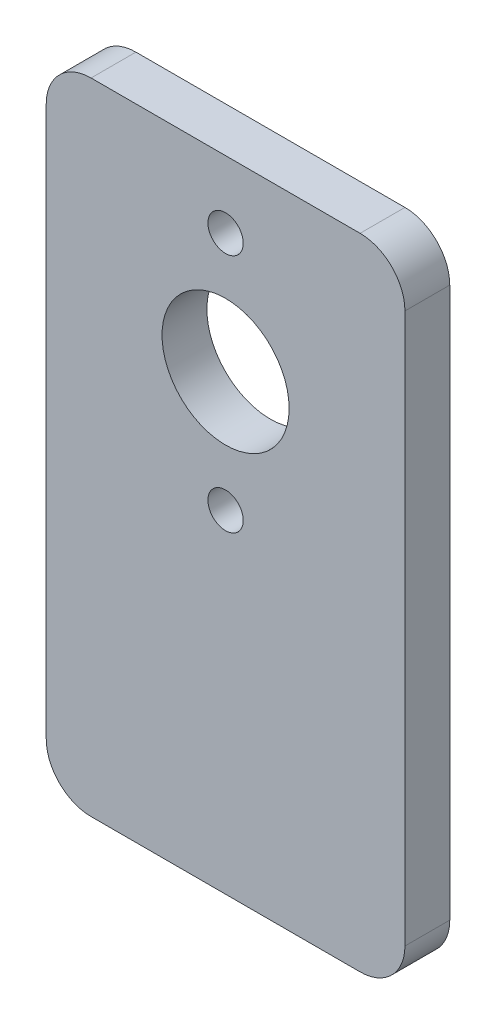
ISO-10303-21;
HEADER;
FILE_DESCRIPTION(('STEP AP214'),'2;1');
FILE_NAME('part.step','',(''),(''),'','','');
FILE_SCHEMA(('AUTOMOTIVE_DESIGN { 1 0 10303 214 1 1 1 1 }'));
ENDSEC;
DATA;
#1=APPLICATION_CONTEXT('core data for automotive mechanical design processes');
#2=APPLICATION_PROTOCOL_DEFINITION('international standard','automotive_design',2000,#1);
#3=PRODUCT_CONTEXT('',#1,'mechanical');
#4=PRODUCT('Part','Part','',(#3));
#5=PRODUCT_RELATED_PRODUCT_CATEGORY('part','',(#4));
#6=PRODUCT_DEFINITION_FORMATION('','',#4);
#7=PRODUCT_DEFINITION_CONTEXT('part definition',#1,'design');
#8=PRODUCT_DEFINITION('design','',#6,#7);
#9=PRODUCT_DEFINITION_SHAPE('','',#8);
#10=(LENGTH_UNIT() NAMED_UNIT(*) SI_UNIT(.MILLI.,.METRE.));
#11=(NAMED_UNIT(*) PLANE_ANGLE_UNIT() SI_UNIT($,.RADIAN.));
#12=(NAMED_UNIT(*) SI_UNIT($,.STERADIAN.) SOLID_ANGLE_UNIT());
#13=UNCERTAINTY_MEASURE_WITH_UNIT(LENGTH_MEASURE(1.E-05),#10,'distance_accuracy_value','');
#14=(GEOMETRIC_REPRESENTATION_CONTEXT(3) GLOBAL_UNCERTAINTY_ASSIGNED_CONTEXT((#13)) GLOBAL_UNIT_ASSIGNED_CONTEXT((#10,
#11,#12)) REPRESENTATION_CONTEXT('',''));
#15=CARTESIAN_POINT('',(0.,0.,0.));
#16=DIRECTION('',(0.,0.,1.));
#17=DIRECTION('',(1.,0.,0.));
#18=AXIS2_PLACEMENT_3D('',#15,#16,#17);
#19=CARTESIAN_POINT('',(12.7,-22.6475,3.175));
#20=DIRECTION('',(-1.,0.,0.));
#21=DIRECTION('',(0.,0.,1.));
#22=AXIS2_PLACEMENT_3D('',#19,#20,#21);
#23=PLANE('',#22);
#24=DIRECTION('',(0.,1.,0.));
#25=VECTOR('',#24,1.);
#26=CARTESIAN_POINT('',(12.7,-22.6475,3.175));
#27=LINE('',#26,#25);
#28=CARTESIAN_POINT('',(12.7,-19.4725,3.175));
#29=VERTEX_POINT('',#28);
#30=CARTESIAN_POINT('',(12.7,19.4725,3.175));
#31=VERTEX_POINT('',#30);
#32=EDGE_CURVE('E139',#29,#31,#27,.T.);
#33=ORIENTED_EDGE('',*,*,#32,.F.);
#34=DIRECTION('',(0.,0.,-1.));
#35=VECTOR('',#34,1.);
#36=CARTESIAN_POINT('',(12.7,-19.4725,3.175));
#37=LINE('',#36,#35);
#38=CARTESIAN_POINT('',(12.7,-19.4725,0.));
#39=VERTEX_POINT('',#38);
#40=EDGE_CURVE('E178',#29,#39,#37,.T.);
#41=ORIENTED_EDGE('',*,*,#40,.T.);
#42=DIRECTION('',(0.,1.,0.));
#43=VECTOR('',#42,1.);
#44=CARTESIAN_POINT('',(12.7,-22.6475,0.));
#45=LINE('',#44,#43);
#46=CARTESIAN_POINT('',(12.7,19.4725,0.));
#47=VERTEX_POINT('',#46);
#48=EDGE_CURVE('E193',#39,#47,#45,.T.);
#49=ORIENTED_EDGE('',*,*,#48,.T.);
#50=DIRECTION('',(0.,0.,-1.));
#51=VECTOR('',#50,1.);
#52=CARTESIAN_POINT('',(12.7,19.4725,3.175));
#53=LINE('',#52,#51);
#54=EDGE_CURVE('E175',#47,#31,#53,.F.);
#55=ORIENTED_EDGE('',*,*,#54,.T.);
#56=EDGE_LOOP('',(#33,#41,#49,#55));
#57=FACE_BOUND('',#56,.T.);
#58=ADVANCED_FACE('F43',(#57),#23,.F.);
#59=CARTESIAN_POINT('',(-12.7,22.6475,3.175));
#60=DIRECTION('',(0.,-1.,0.));
#61=DIRECTION('',(0.,0.,-1.));
#62=AXIS2_PLACEMENT_3D('',#59,#60,#61);
#63=PLANE('',#62);
#64=DIRECTION('',(-1.,0.,0.));
#65=VECTOR('',#64,1.);
#66=CARTESIAN_POINT('',(-12.7,22.6475,3.175));
#67=LINE('',#66,#65);
#68=CARTESIAN_POINT('',(9.525,22.6475,3.175));
#69=VERTEX_POINT('',#68);
#70=CARTESIAN_POINT('',(-9.525,22.6475,3.175));
#71=VERTEX_POINT('',#70);
#72=EDGE_CURVE('E144',#69,#71,#67,.T.);
#73=ORIENTED_EDGE('',*,*,#72,.F.);
#74=DIRECTION('',(0.,0.,-1.));
#75=VECTOR('',#74,1.);
#76=CARTESIAN_POINT('',(9.525,22.6475,3.175));
#77=LINE('',#76,#75);
#78=CARTESIAN_POINT('',(9.525,22.6475,0.));
#79=VERTEX_POINT('',#78);
#80=EDGE_CURVE('E11',#69,#79,#77,.T.);
#81=ORIENTED_EDGE('',*,*,#80,.T.);
#82=DIRECTION('',(-1.,0.,0.));
#83=VECTOR('',#82,1.);
#84=CARTESIAN_POINT('',(-12.7,22.6475,0.));
#85=LINE('',#84,#83);
#86=CARTESIAN_POINT('',(-9.525,22.6475,0.));
#87=VERTEX_POINT('',#86);
#88=EDGE_CURVE('E146',#79,#87,#85,.T.);
#89=ORIENTED_EDGE('',*,*,#88,.T.);
#90=DIRECTION('',(0.,0.,-1.));
#91=VECTOR('',#90,1.);
#92=CARTESIAN_POINT('',(-9.525,22.6475,3.175));
#93=LINE('',#92,#91);
#94=EDGE_CURVE('E52',#87,#71,#93,.F.);
#95=ORIENTED_EDGE('',*,*,#94,.T.);
#96=EDGE_LOOP('',(#73,#81,#89,#95));
#97=FACE_BOUND('',#96,.T.);
#98=ADVANCED_FACE('F199',(#97),#63,.F.);
#99=CARTESIAN_POINT('',(-12.7,-22.6475,3.175));
#100=DIRECTION('',(1.,0.,0.));
#101=DIRECTION('',(0.,0.,-1.));
#102=AXIS2_PLACEMENT_3D('',#99,#100,#101);
#103=PLANE('',#102);
#104=DIRECTION('',(0.,-1.,0.));
#105=VECTOR('',#104,1.);
#106=CARTESIAN_POINT('',(-12.7,-22.6475,0.));
#107=LINE('',#106,#105);
#108=CARTESIAN_POINT('',(-12.7,19.4725,0.));
#109=VERTEX_POINT('',#108);
#110=CARTESIAN_POINT('',(-12.7,-19.4725,0.));
#111=VERTEX_POINT('',#110);
#112=EDGE_CURVE('E140',#109,#111,#107,.T.);
#113=ORIENTED_EDGE('',*,*,#112,.T.);
#114=DIRECTION('',(0.,0.,-1.));
#115=VECTOR('',#114,1.);
#116=CARTESIAN_POINT('',(-12.7,-19.4725,3.175));
#117=LINE('',#116,#115);
#118=CARTESIAN_POINT('',(-12.7,-19.4725,3.175));
#119=VERTEX_POINT('',#118);
#120=EDGE_CURVE('E115',#111,#119,#117,.F.);
#121=ORIENTED_EDGE('',*,*,#120,.T.);
#122=DIRECTION('',(0.,-1.,0.));
#123=VECTOR('',#122,1.);
#124=CARTESIAN_POINT('',(-12.7,-22.6475,3.175));
#125=LINE('',#124,#123);
#126=CARTESIAN_POINT('',(-12.7,19.4725,3.175));
#127=VERTEX_POINT('',#126);
#128=EDGE_CURVE('E184',#127,#119,#125,.T.);
#129=ORIENTED_EDGE('',*,*,#128,.F.);
#130=DIRECTION('',(0.,0.,-1.));
#131=VECTOR('',#130,1.);
#132=CARTESIAN_POINT('',(-12.7,19.4725,3.175));
#133=LINE('',#132,#131);
#134=EDGE_CURVE('E121',#127,#109,#133,.T.);
#135=ORIENTED_EDGE('',*,*,#134,.T.);
#136=EDGE_LOOP('',(#113,#121,#129,#135));
#137=FACE_BOUND('',#136,.T.);
#138=ADVANCED_FACE('F206',(#137),#103,.F.);
#139=CARTESIAN_POINT('',(-12.7,-22.6475,3.175));
#140=DIRECTION('',(0.,1.,0.));
#141=DIRECTION('',(0.,0.,1.));
#142=AXIS2_PLACEMENT_3D('',#139,#140,#141);
#143=PLANE('',#142);
#144=DIRECTION('',(1.,0.,0.));
#145=VECTOR('',#144,1.);
#146=CARTESIAN_POINT('',(-12.7,-22.6475,3.175));
#147=LINE('',#146,#145);
#148=CARTESIAN_POINT('',(-9.525,-22.6475,3.175));
#149=VERTEX_POINT('',#148);
#150=CARTESIAN_POINT('',(9.525,-22.6475,3.175));
#151=VERTEX_POINT('',#150);
#152=EDGE_CURVE('E131',#149,#151,#147,.T.);
#153=ORIENTED_EDGE('',*,*,#152,.F.);
#154=DIRECTION('',(0.,0.,-1.));
#155=VECTOR('',#154,1.);
#156=CARTESIAN_POINT('',(-9.525,-22.6475,3.175));
#157=LINE('',#156,#155);
#158=CARTESIAN_POINT('',(-9.525,-22.6475,0.));
#159=VERTEX_POINT('',#158);
#160=EDGE_CURVE('E114',#149,#159,#157,.T.);
#161=ORIENTED_EDGE('',*,*,#160,.T.);
#162=DIRECTION('',(1.,0.,0.));
#163=VECTOR('',#162,1.);
#164=CARTESIAN_POINT('',(-12.7,-22.6475,0.));
#165=LINE('',#164,#163);
#166=CARTESIAN_POINT('',(9.525,-22.6475,0.));
#167=VERTEX_POINT('',#166);
#168=EDGE_CURVE('E128',#159,#167,#165,.T.);
#169=ORIENTED_EDGE('',*,*,#168,.T.);
#170=DIRECTION('',(0.,0.,-1.));
#171=VECTOR('',#170,1.);
#172=CARTESIAN_POINT('',(9.525,-22.6475,3.175));
#173=LINE('',#172,#171);
#174=EDGE_CURVE('E134',#167,#151,#173,.F.);
#175=ORIENTED_EDGE('',*,*,#174,.T.);
#176=EDGE_LOOP('',(#153,#161,#169,#175));
#177=FACE_BOUND('',#176,.T.);
#178=ADVANCED_FACE('F127',(#177),#143,.F.);
#179=CARTESIAN_POINT('',(0.,0.,3.175));
#180=DIRECTION('',(0.,0.,-1.));
#181=DIRECTION('',(-1.,0.,0.));
#182=AXIS2_PLACEMENT_3D('',#179,#180,#181);
#183=PLANE('',#182);
#184=CARTESIAN_POINT('',(0.,17.8975,3.175));
#185=DIRECTION('',(0.,0.,1.));
#186=DIRECTION('',(1.,0.,0.));
#187=AXIS2_PLACEMENT_3D('',#184,#185,#186);
#188=CIRCLE('',#187,1.24999999999999);
#189=CARTESIAN_POINT('',(1.24999999999999,17.8975,3.175));
#190=VERTEX_POINT('',#189);
#191=EDGE_CURVE('E375',#190,#190,#188,.T.);
#192=ORIENTED_EDGE('',*,*,#191,.F.);
#193=EDGE_LOOP('',(#192));
#194=FACE_BOUND('',#193,.T.);
#195=CARTESIAN_POINT('',(0.,0.897499999999999,3.175));
#196=DIRECTION('',(0.,0.,1.));
#197=DIRECTION('',(1.,0.,0.));
#198=AXIS2_PLACEMENT_3D('',#195,#196,#197);
#199=CIRCLE('',#198,1.24999999999999);
#200=CARTESIAN_POINT('',(1.24999999999999,0.897499999999999,3.175));
#201=VERTEX_POINT('',#200);
#202=EDGE_CURVE('E365',#201,#201,#199,.T.);
#203=ORIENTED_EDGE('',*,*,#202,.F.);
#204=EDGE_LOOP('',(#203));
#205=FACE_BOUND('',#204,.T.);
#206=CARTESIAN_POINT('',(0.,9.3975,3.175));
#207=DIRECTION('',(0.,0.,1.));
#208=DIRECTION('',(1.,0.,0.));
#209=AXIS2_PLACEMENT_3D('',#206,#207,#208);
#210=CIRCLE('',#209,4.5);
#211=CARTESIAN_POINT('',(4.5,9.3975,3.175));
#212=VERTEX_POINT('',#211);
#213=EDGE_CURVE('E357',#212,#212,#210,.T.);
#214=ORIENTED_EDGE('',*,*,#213,.F.);
#215=EDGE_LOOP('',(#214));
#216=FACE_BOUND('',#215,.T.);
#217=ORIENTED_EDGE('',*,*,#128,.T.);
#218=CARTESIAN_POINT('',(-9.525,-19.4725,3.175));
#219=DIRECTION('',(0.,0.,-1.));
#220=DIRECTION('',(-1.,0.,0.));
#221=AXIS2_PLACEMENT_3D('',#218,#219,#220);
#222=CIRCLE('',#221,3.175);
#223=EDGE_CURVE('E172',#119,#149,#222,.F.);
#224=ORIENTED_EDGE('',*,*,#223,.T.);
#225=ORIENTED_EDGE('',*,*,#152,.T.);
#226=CARTESIAN_POINT('',(9.525,-19.4725,3.175));
#227=DIRECTION('',(0.,0.,-1.));
#228=DIRECTION('',(-1.,0.,0.));
#229=AXIS2_PLACEMENT_3D('',#226,#227,#228);
#230=CIRCLE('',#229,3.175);
#231=EDGE_CURVE('E169',#151,#29,#230,.F.);
#232=ORIENTED_EDGE('',*,*,#231,.T.);
#233=ORIENTED_EDGE('',*,*,#32,.T.);
#234=CARTESIAN_POINT('',(9.525,19.4725,3.175));
#235=DIRECTION('',(0.,0.,-1.));
#236=DIRECTION('',(-1.,0.,0.));
#237=AXIS2_PLACEMENT_3D('',#234,#235,#236);
#238=CIRCLE('',#237,3.175);
#239=EDGE_CURVE('E65',#31,#69,#238,.F.);
#240=ORIENTED_EDGE('',*,*,#239,.T.);
#241=ORIENTED_EDGE('',*,*,#72,.T.);
#242=CARTESIAN_POINT('',(-9.525,19.4725,3.175));
#243=DIRECTION('',(0.,0.,-1.));
#244=DIRECTION('',(-1.,0.,0.));
#245=AXIS2_PLACEMENT_3D('',#242,#243,#244);
#246=CIRCLE('',#245,3.175);
#247=EDGE_CURVE('E164',#71,#127,#246,.F.);
#248=ORIENTED_EDGE('',*,*,#247,.T.);
#249=EDGE_LOOP('',(#217,#224,#225,#232,#233,#240,#241,#248));
#250=FACE_BOUND('',#249,.T.);
#251=ADVANCED_FACE('F204',(#194,#205,#216,#250),#183,.F.);
#252=CARTESIAN_POINT('',(0.,0.,0.));
#253=DIRECTION('',(0.,0.,-1.));
#254=DIRECTION('',(-1.,0.,0.));
#255=AXIS2_PLACEMENT_3D('',#252,#253,#254);
#256=PLANE('',#255);
#257=CARTESIAN_POINT('',(0.,17.8975,0.));
#258=DIRECTION('',(0.,0.,1.));
#259=DIRECTION('',(1.,0.,0.));
#260=AXIS2_PLACEMENT_3D('',#257,#258,#259);
#261=CIRCLE('',#260,1.25);
#262=CARTESIAN_POINT('',(1.25,17.8975,0.));
#263=VERTEX_POINT('',#262);
#264=EDGE_CURVE('E371',#263,#263,#261,.T.);
#265=ORIENTED_EDGE('',*,*,#264,.T.);
#266=EDGE_LOOP('',(#265));
#267=FACE_BOUND('',#266,.T.);
#268=CARTESIAN_POINT('',(0.,0.897499999999999,0.));
#269=DIRECTION('',(0.,0.,1.));
#270=DIRECTION('',(1.,0.,0.));
#271=AXIS2_PLACEMENT_3D('',#268,#269,#270);
#272=CIRCLE('',#271,1.25);
#273=CARTESIAN_POINT('',(1.25,0.897499999999999,0.));
#274=VERTEX_POINT('',#273);
#275=EDGE_CURVE('E360',#274,#274,#272,.T.);
#276=ORIENTED_EDGE('',*,*,#275,.T.);
#277=EDGE_LOOP('',(#276));
#278=FACE_BOUND('',#277,.T.);
#279=CARTESIAN_POINT('',(0.,9.3975,0.));
#280=DIRECTION('',(0.,0.,1.));
#281=DIRECTION('',(1.,0.,0.));
#282=AXIS2_PLACEMENT_3D('',#279,#280,#281);
#283=CIRCLE('',#282,4.5);
#284=CARTESIAN_POINT('',(4.5,9.3975,0.));
#285=VERTEX_POINT('',#284);
#286=EDGE_CURVE('E196',#285,#285,#283,.T.);
#287=ORIENTED_EDGE('',*,*,#286,.T.);
#288=EDGE_LOOP('',(#287));
#289=FACE_BOUND('',#288,.T.);
#290=ORIENTED_EDGE('',*,*,#168,.F.);
#291=CARTESIAN_POINT('',(-9.525,-19.4725,0.));
#292=DIRECTION('',(0.,0.,-1.));
#293=DIRECTION('',(-1.,0.,0.));
#294=AXIS2_PLACEMENT_3D('',#291,#292,#293);
#295=CIRCLE('',#294,3.175);
#296=EDGE_CURVE('E110',#159,#111,#295,.T.);
#297=ORIENTED_EDGE('',*,*,#296,.T.);
#298=ORIENTED_EDGE('',*,*,#112,.F.);
#299=CARTESIAN_POINT('',(-9.525,19.4725,0.));
#300=DIRECTION('',(0.,0.,-1.));
#301=DIRECTION('',(-1.,0.,0.));
#302=AXIS2_PLACEMENT_3D('',#299,#300,#301);
#303=CIRCLE('',#302,3.175);
#304=EDGE_CURVE('E133',#109,#87,#303,.T.);
#305=ORIENTED_EDGE('',*,*,#304,.T.);
#306=ORIENTED_EDGE('',*,*,#88,.F.);
#307=CARTESIAN_POINT('',(9.525,19.4725,0.));
#308=DIRECTION('',(0.,0.,-1.));
#309=DIRECTION('',(-1.,0.,0.));
#310=AXIS2_PLACEMENT_3D('',#307,#308,#309);
#311=CIRCLE('',#310,3.175);
#312=EDGE_CURVE('E154',#79,#47,#311,.T.);
#313=ORIENTED_EDGE('',*,*,#312,.T.);
#314=ORIENTED_EDGE('',*,*,#48,.F.);
#315=CARTESIAN_POINT('',(9.525,-19.4725,0.));
#316=DIRECTION('',(0.,0.,-1.));
#317=DIRECTION('',(-1.,0.,0.));
#318=AXIS2_PLACEMENT_3D('',#315,#316,#317);
#319=CIRCLE('',#318,3.175);
#320=EDGE_CURVE('E122',#39,#167,#319,.T.);
#321=ORIENTED_EDGE('',*,*,#320,.T.);
#322=EDGE_LOOP('',(#290,#297,#298,#305,#306,#313,#314,#321));
#323=FACE_BOUND('',#322,.T.);
#324=ADVANCED_FACE('F136',(#267,#278,#289,#323),#256,.T.);
#325=CARTESIAN_POINT('',(0.,9.3975,0.));
#326=DIRECTION('',(0.,0.,1.));
#327=DIRECTION('',(1.,0.,0.));
#328=AXIS2_PLACEMENT_3D('',#325,#326,#327);
#329=CYLINDRICAL_SURFACE('',#328,4.5);
#330=ORIENTED_EDGE('',*,*,#286,.F.);
#331=EDGE_LOOP('',(#330));
#332=FACE_BOUND('',#331,.T.);
#333=ORIENTED_EDGE('',*,*,#213,.T.);
#334=EDGE_LOOP('',(#333));
#335=FACE_BOUND('',#334,.T.);
#336=ADVANCED_FACE('F270',(#332,#335),#329,.F.);
#337=CARTESIAN_POINT('',(0.,0.897499999999999,3.175));
#338=DIRECTION('',(0.,0.,1.));
#339=DIRECTION('',(1.,0.,0.));
#340=AXIS2_PLACEMENT_3D('',#337,#338,#339);
#341=CYLINDRICAL_SURFACE('',#340,1.24999999999999);
#342=ORIENTED_EDGE('',*,*,#275,.F.);
#343=EDGE_LOOP('',(#342));
#344=FACE_BOUND('',#343,.T.);
#345=ORIENTED_EDGE('',*,*,#202,.T.);
#346=EDGE_LOOP('',(#345));
#347=FACE_BOUND('',#346,.T.);
#348=ADVANCED_FACE('F315',(#344,#347),#341,.F.);
#349=CARTESIAN_POINT('',(0.,17.8975,3.175));
#350=DIRECTION('',(0.,0.,1.));
#351=DIRECTION('',(1.,0.,0.));
#352=AXIS2_PLACEMENT_3D('',#349,#350,#351);
#353=CYLINDRICAL_SURFACE('',#352,1.24999999999999);
#354=ORIENTED_EDGE('',*,*,#264,.F.);
#355=EDGE_LOOP('',(#354));
#356=FACE_BOUND('',#355,.T.);
#357=ORIENTED_EDGE('',*,*,#191,.T.);
#358=EDGE_LOOP('',(#357));
#359=FACE_BOUND('',#358,.T.);
#360=ADVANCED_FACE('F225',(#356,#359),#353,.F.);
#361=CARTESIAN_POINT('',(-9.525,-19.4725,3.175));
#362=DIRECTION('',(0.,0.,-1.));
#363=DIRECTION('',(-1.,0.,0.));
#364=AXIS2_PLACEMENT_3D('',#361,#362,#363);
#365=CYLINDRICAL_SURFACE('',#364,3.175);
#366=ORIENTED_EDGE('',*,*,#223,.F.);
#367=ORIENTED_EDGE('',*,*,#120,.F.);
#368=ORIENTED_EDGE('',*,*,#296,.F.);
#369=ORIENTED_EDGE('',*,*,#160,.F.);
#370=EDGE_LOOP('',(#366,#367,#368,#369));
#371=FACE_BOUND('',#370,.T.);
#372=ADVANCED_FACE('F113',(#371),#365,.T.);
#373=CARTESIAN_POINT('',(9.525,-19.4725,3.175));
#374=DIRECTION('',(0.,0.,-1.));
#375=DIRECTION('',(-1.,0.,0.));
#376=AXIS2_PLACEMENT_3D('',#373,#374,#375);
#377=CYLINDRICAL_SURFACE('',#376,3.175);
#378=ORIENTED_EDGE('',*,*,#231,.F.);
#379=ORIENTED_EDGE('',*,*,#174,.F.);
#380=ORIENTED_EDGE('',*,*,#320,.F.);
#381=ORIENTED_EDGE('',*,*,#40,.F.);
#382=EDGE_LOOP('',(#378,#379,#380,#381));
#383=FACE_BOUND('',#382,.T.);
#384=ADVANCED_FACE('F224',(#383),#377,.T.);
#385=CARTESIAN_POINT('',(9.525,19.4725,3.175));
#386=DIRECTION('',(0.,0.,-1.));
#387=DIRECTION('',(-1.,0.,0.));
#388=AXIS2_PLACEMENT_3D('',#385,#386,#387);
#389=CYLINDRICAL_SURFACE('',#388,3.175);
#390=ORIENTED_EDGE('',*,*,#239,.F.);
#391=ORIENTED_EDGE('',*,*,#54,.F.);
#392=ORIENTED_EDGE('',*,*,#312,.F.);
#393=ORIENTED_EDGE('',*,*,#80,.F.);
#394=EDGE_LOOP('',(#390,#391,#392,#393));
#395=FACE_BOUND('',#394,.T.);
#396=ADVANCED_FACE('F227',(#395),#389,.T.);
#397=CARTESIAN_POINT('',(-9.525,19.4725,3.175));
#398=DIRECTION('',(0.,0.,-1.));
#399=DIRECTION('',(-1.,0.,0.));
#400=AXIS2_PLACEMENT_3D('',#397,#398,#399);
#401=CYLINDRICAL_SURFACE('',#400,3.175);
#402=ORIENTED_EDGE('',*,*,#247,.F.);
#403=ORIENTED_EDGE('',*,*,#94,.F.);
#404=ORIENTED_EDGE('',*,*,#304,.F.);
#405=ORIENTED_EDGE('',*,*,#134,.F.);
#406=EDGE_LOOP('',(#402,#403,#404,#405));
#407=FACE_BOUND('',#406,.T.);
#408=ADVANCED_FACE('F45',(#407),#401,.T.);
#409=CLOSED_SHELL('',(#58,#98,#138,#178,#251,#324,#336,#348,#360,#372,#384,#396,#408));
#410=MANIFOLD_SOLID_BREP('B2',#409);
#411=ADVANCED_BREP_SHAPE_REPRESENTATION('',(#18,#410),#14);
#412=SHAPE_DEFINITION_REPRESENTATION(#9,#411);
ENDSEC;
END-ISO-10303-21;
